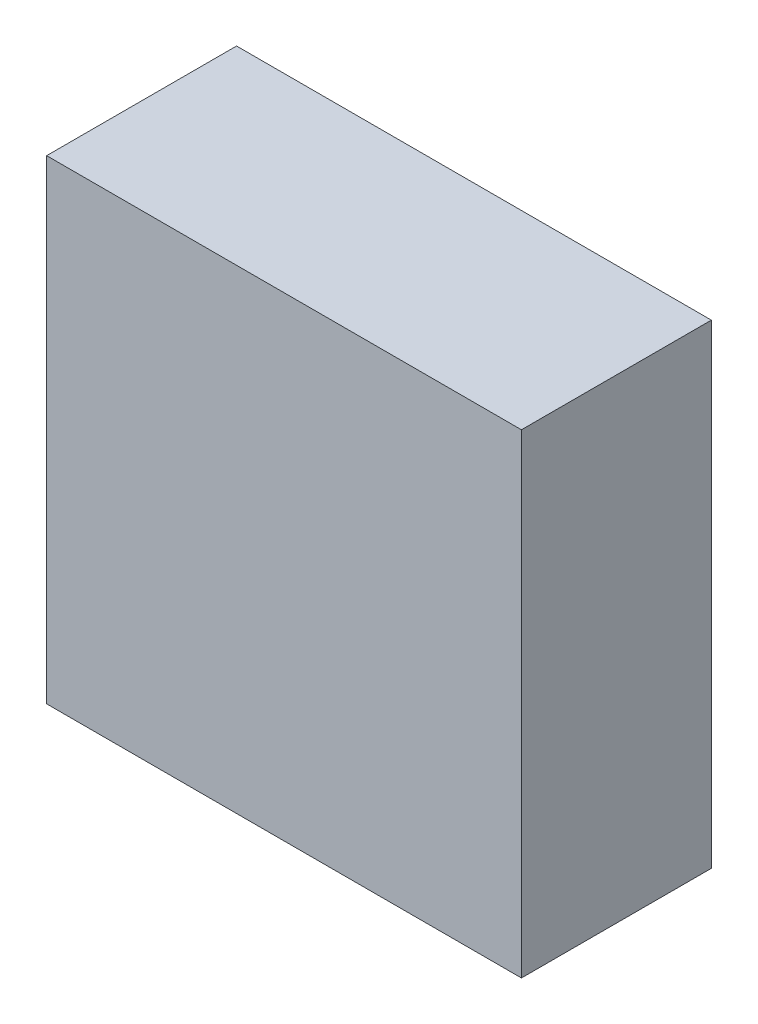
ISO-10303-21;
HEADER;
FILE_DESCRIPTION(('STEP AP214'),'2;1');
FILE_NAME('part.step','',(''),(''),'','','');
FILE_SCHEMA(('AUTOMOTIVE_DESIGN { 1 0 10303 214 1 1 1 1 }'));
ENDSEC;
DATA;
#1=APPLICATION_CONTEXT('core data for automotive mechanical design processes');
#2=APPLICATION_PROTOCOL_DEFINITION('international standard','automotive_design',2000,#1);
#3=PRODUCT_CONTEXT('',#1,'mechanical');
#4=PRODUCT('Part','Part','',(#3));
#5=PRODUCT_RELATED_PRODUCT_CATEGORY('part','',(#4));
#6=PRODUCT_DEFINITION_FORMATION('','',#4);
#7=PRODUCT_DEFINITION_CONTEXT('part definition',#1,'design');
#8=PRODUCT_DEFINITION('design','',#6,#7);
#9=PRODUCT_DEFINITION_SHAPE('','',#8);
#10=(LENGTH_UNIT() NAMED_UNIT(*) SI_UNIT(.MILLI.,.METRE.));
#11=(NAMED_UNIT(*) PLANE_ANGLE_UNIT() SI_UNIT($,.RADIAN.));
#12=(NAMED_UNIT(*) SI_UNIT($,.STERADIAN.) SOLID_ANGLE_UNIT());
#13=UNCERTAINTY_MEASURE_WITH_UNIT(LENGTH_MEASURE(1.E-05),#10,'distance_accuracy_value','');
#14=(GEOMETRIC_REPRESENTATION_CONTEXT(3) GLOBAL_UNCERTAINTY_ASSIGNED_CONTEXT((#13)) GLOBAL_UNIT_ASSIGNED_CONTEXT((#10,
#11,#12)) REPRESENTATION_CONTEXT('',''));
#15=CARTESIAN_POINT('',(0.,0.,0.));
#16=DIRECTION('',(0.,0.,1.));
#17=DIRECTION('',(1.,0.,0.));
#18=AXIS2_PLACEMENT_3D('',#15,#16,#17);
#19=CARTESIAN_POINT('',(-1.,1.,0.8));
#20=DIRECTION('',(1.,0.,0.));
#21=DIRECTION('',(0.,1.,0.));
#22=AXIS2_PLACEMENT_3D('',#19,#20,#21);
#23=PLANE('',#22);
#24=DIRECTION('',(0.,-1.,0.));
#25=VECTOR('',#24,1.);
#26=CARTESIAN_POINT('',(-1.,1.,0.));
#27=LINE('',#26,#25);
#28=CARTESIAN_POINT('',(-1.,1.,0.));
#29=VERTEX_POINT('',#28);
#30=CARTESIAN_POINT('',(-1.,-1.,0.));
#31=VERTEX_POINT('',#30);
#32=EDGE_CURVE('E96',#29,#31,#27,.T.);
#33=ORIENTED_EDGE('',*,*,#32,.T.);
#34=DIRECTION('',(0.,0.,-1.));
#35=VECTOR('',#34,1.);
#36=CARTESIAN_POINT('',(-1.,-1.,0.8));
#37=LINE('',#36,#35);
#38=CARTESIAN_POINT('',(-1.,-1.,0.8));
#39=VERTEX_POINT('',#38);
#40=EDGE_CURVE('E11',#39,#31,#37,.T.);
#41=ORIENTED_EDGE('',*,*,#40,.F.);
#42=DIRECTION('',(0.,-1.,0.));
#43=VECTOR('',#42,1.);
#44=CARTESIAN_POINT('',(-1.,1.,0.8));
#45=LINE('',#44,#43);
#46=CARTESIAN_POINT('',(-1.,1.,0.8));
#47=VERTEX_POINT('',#46);
#48=EDGE_CURVE('E84',#47,#39,#45,.T.);
#49=ORIENTED_EDGE('',*,*,#48,.F.);
#50=DIRECTION('',(0.,0.,-1.));
#51=VECTOR('',#50,1.);
#52=CARTESIAN_POINT('',(-1.,1.,0.8));
#53=LINE('',#52,#51);
#54=EDGE_CURVE('E92',#47,#29,#53,.T.);
#55=ORIENTED_EDGE('',*,*,#54,.T.);
#56=EDGE_LOOP('',(#33,#41,#49,#55));
#57=FACE_BOUND('',#56,.T.);
#58=ADVANCED_FACE('F33',(#57),#23,.F.);
#59=CARTESIAN_POINT('',(-1.,-1.,0.8));
#60=DIRECTION('',(0.,1.,0.));
#61=DIRECTION('',(-1.,0.,0.));
#62=AXIS2_PLACEMENT_3D('',#59,#60,#61);
#63=PLANE('',#62);
#64=DIRECTION('',(1.,0.,0.));
#65=VECTOR('',#64,1.);
#66=CARTESIAN_POINT('',(-1.,-1.,0.));
#67=LINE('',#66,#65);
#68=CARTESIAN_POINT('',(1.,-1.,0.));
#69=VERTEX_POINT('',#68);
#70=EDGE_CURVE('E88',#31,#69,#67,.T.);
#71=ORIENTED_EDGE('',*,*,#70,.T.);
#72=DIRECTION('',(0.,0.,-1.));
#73=VECTOR('',#72,1.);
#74=CARTESIAN_POINT('',(1.,-1.,0.8));
#75=LINE('',#74,#73);
#76=CARTESIAN_POINT('',(1.,-1.,0.8));
#77=VERTEX_POINT('',#76);
#78=EDGE_CURVE('E41',#77,#69,#75,.T.);
#79=ORIENTED_EDGE('',*,*,#78,.F.);
#80=DIRECTION('',(1.,0.,0.));
#81=VECTOR('',#80,1.);
#82=CARTESIAN_POINT('',(-1.,-1.,0.8));
#83=LINE('',#82,#81);
#84=EDGE_CURVE('E79',#39,#77,#83,.T.);
#85=ORIENTED_EDGE('',*,*,#84,.F.);
#86=ORIENTED_EDGE('',*,*,#40,.T.);
#87=EDGE_LOOP('',(#71,#79,#85,#86));
#88=FACE_BOUND('',#87,.T.);
#89=ADVANCED_FACE('F87',(#88),#63,.F.);
#90=CARTESIAN_POINT('',(1.,1.,0.8));
#91=DIRECTION('',(-1.,0.,0.));
#92=DIRECTION('',(0.,-1.,0.));
#93=AXIS2_PLACEMENT_3D('',#90,#91,#92);
#94=PLANE('',#93);
#95=DIRECTION('',(0.,1.,0.));
#96=VECTOR('',#95,1.);
#97=CARTESIAN_POINT('',(1.,1.,0.));
#98=LINE('',#97,#96);
#99=CARTESIAN_POINT('',(1.,1.,0.));
#100=VERTEX_POINT('',#99);
#101=EDGE_CURVE('E66',#69,#100,#98,.T.);
#102=ORIENTED_EDGE('',*,*,#101,.T.);
#103=DIRECTION('',(0.,0.,-1.));
#104=VECTOR('',#103,1.);
#105=CARTESIAN_POINT('',(1.,1.,0.8));
#106=LINE('',#105,#104);
#107=CARTESIAN_POINT('',(1.,1.,0.8));
#108=VERTEX_POINT('',#107);
#109=EDGE_CURVE('E89',#108,#100,#106,.T.);
#110=ORIENTED_EDGE('',*,*,#109,.F.);
#111=DIRECTION('',(0.,1.,0.));
#112=VECTOR('',#111,1.);
#113=CARTESIAN_POINT('',(1.,1.,0.8));
#114=LINE('',#113,#112);
#115=EDGE_CURVE('E82',#77,#108,#114,.T.);
#116=ORIENTED_EDGE('',*,*,#115,.F.);
#117=ORIENTED_EDGE('',*,*,#78,.T.);
#118=EDGE_LOOP('',(#102,#110,#116,#117));
#119=FACE_BOUND('',#118,.T.);
#120=ADVANCED_FACE('F90',(#119),#94,.F.);
#121=CARTESIAN_POINT('',(-1.,1.,0.8));
#122=DIRECTION('',(0.,-1.,0.));
#123=DIRECTION('',(0.,0.,-1.));
#124=AXIS2_PLACEMENT_3D('',#121,#122,#123);
#125=PLANE('',#124);
#126=DIRECTION('',(-1.,0.,0.));
#127=VECTOR('',#126,1.);
#128=CARTESIAN_POINT('',(-1.,1.,0.));
#129=LINE('',#128,#127);
#130=EDGE_CURVE('E72',#100,#29,#129,.T.);
#131=ORIENTED_EDGE('',*,*,#130,.T.);
#132=ORIENTED_EDGE('',*,*,#54,.F.);
#133=DIRECTION('',(-1.,0.,0.));
#134=VECTOR('',#133,1.);
#135=CARTESIAN_POINT('',(-1.,1.,0.8));
#136=LINE('',#135,#134);
#137=EDGE_CURVE('E49',#108,#47,#136,.T.);
#138=ORIENTED_EDGE('',*,*,#137,.F.);
#139=ORIENTED_EDGE('',*,*,#109,.T.);
#140=EDGE_LOOP('',(#131,#132,#138,#139));
#141=FACE_BOUND('',#140,.T.);
#142=ADVANCED_FACE('F103',(#141),#125,.F.);
#143=CARTESIAN_POINT('',(0.,0.,0.8));
#144=DIRECTION('',(0.,0.,1.));
#145=DIRECTION('',(1.,0.,0.));
#146=AXIS2_PLACEMENT_3D('',#143,#144,#145);
#147=PLANE('',#146);
#148=ORIENTED_EDGE('',*,*,#48,.T.);
#149=ORIENTED_EDGE('',*,*,#84,.T.);
#150=ORIENTED_EDGE('',*,*,#115,.T.);
#151=ORIENTED_EDGE('',*,*,#137,.T.);
#152=EDGE_LOOP('',(#148,#149,#150,#151));
#153=FACE_BOUND('',#152,.T.);
#154=ADVANCED_FACE('F80',(#153),#147,.T.);
#155=CARTESIAN_POINT('',(0.,0.,0.));
#156=DIRECTION('',(0.,0.,1.));
#157=DIRECTION('',(1.,0.,0.));
#158=AXIS2_PLACEMENT_3D('',#155,#156,#157);
#159=PLANE('',#158);
#160=ORIENTED_EDGE('',*,*,#32,.F.);
#161=ORIENTED_EDGE('',*,*,#130,.F.);
#162=ORIENTED_EDGE('',*,*,#101,.F.);
#163=ORIENTED_EDGE('',*,*,#70,.F.);
#164=EDGE_LOOP('',(#160,#161,#162,#163));
#165=FACE_BOUND('',#164,.T.);
#166=ADVANCED_FACE('F106',(#165),#159,.F.);
#167=CLOSED_SHELL('',(#58,#89,#120,#142,#154,#166));
#168=MANIFOLD_SOLID_BREP('B2',#167);
#169=ADVANCED_BREP_SHAPE_REPRESENTATION('',(#18,#168),#14);
#170=SHAPE_DEFINITION_REPRESENTATION(#9,#169);
ENDSEC;
END-ISO-10303-21;
